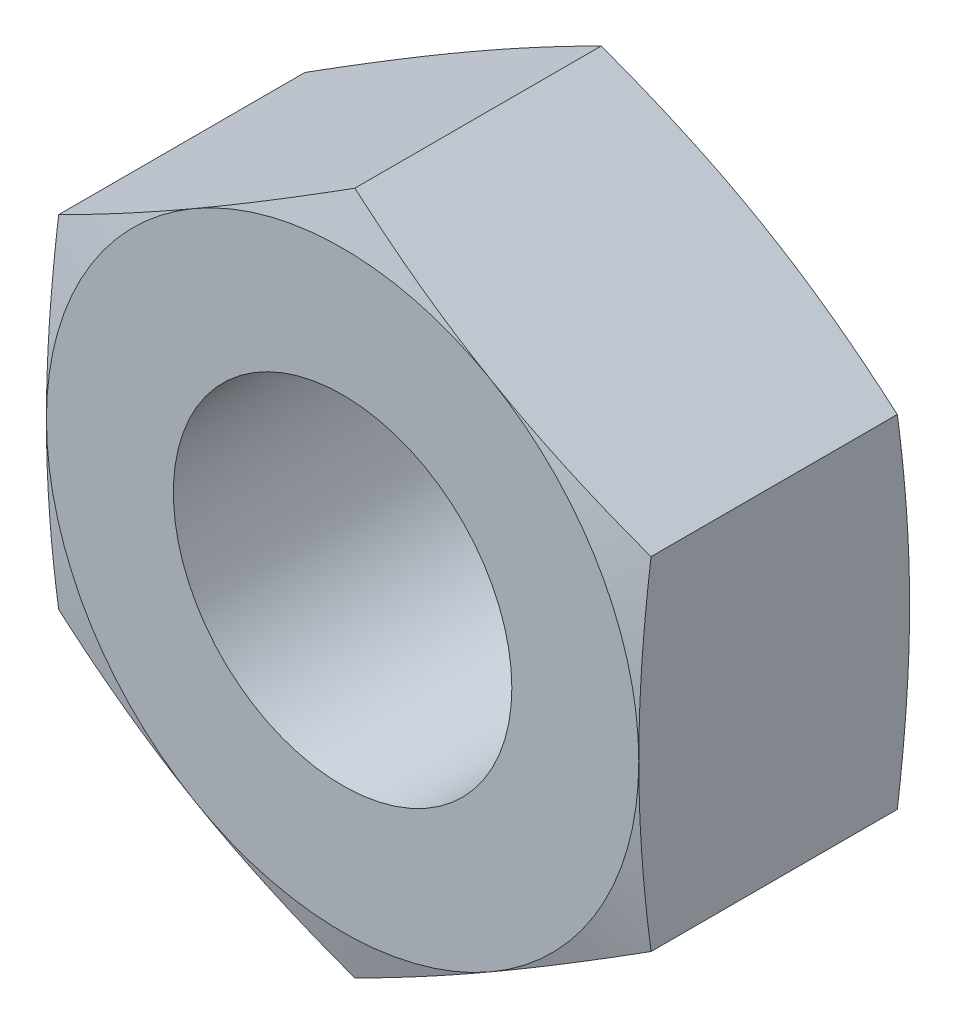
ISO-10303-21;
HEADER;
FILE_DESCRIPTION(('STEP AP214'),'2;1');
FILE_NAME('part.step','',(''),(''),'','','');
FILE_SCHEMA(('AUTOMOTIVE_DESIGN { 1 0 10303 214 1 1 1 1 }'));
ENDSEC;
DATA;
#1=APPLICATION_CONTEXT('core data for automotive mechanical design processes');
#2=APPLICATION_PROTOCOL_DEFINITION('international standard','automotive_design',2000,#1);
#3=PRODUCT_CONTEXT('',#1,'mechanical');
#4=PRODUCT('Part','Part','',(#3));
#5=PRODUCT_RELATED_PRODUCT_CATEGORY('part','',(#4));
#6=PRODUCT_DEFINITION_FORMATION('','',#4);
#7=PRODUCT_DEFINITION_CONTEXT('part definition',#1,'design');
#8=PRODUCT_DEFINITION('design','',#6,#7);
#9=PRODUCT_DEFINITION_SHAPE('','',#8);
#10=(LENGTH_UNIT() NAMED_UNIT(*) SI_UNIT(.MILLI.,.METRE.));
#11=(NAMED_UNIT(*) PLANE_ANGLE_UNIT() SI_UNIT($,.RADIAN.));
#12=(NAMED_UNIT(*) SI_UNIT($,.STERADIAN.) SOLID_ANGLE_UNIT());
#13=UNCERTAINTY_MEASURE_WITH_UNIT(LENGTH_MEASURE(1.E-05),#10,'distance_accuracy_value','');
#14=(GEOMETRIC_REPRESENTATION_CONTEXT(3) GLOBAL_UNCERTAINTY_ASSIGNED_CONTEXT((#13)) GLOBAL_UNIT_ASSIGNED_CONTEXT((#10,
#11,#12)) REPRESENTATION_CONTEXT('',''));
#15=CARTESIAN_POINT('',(0.,0.,0.));
#16=DIRECTION('',(0.,0.,1.));
#17=DIRECTION('',(1.,0.,0.));
#18=AXIS2_PLACEMENT_3D('',#15,#16,#17);
#19=CARTESIAN_POINT('',(3.49999999999998,2.02072594216372,3.2));
#20=DIRECTION('',(-0.499999999999994,-0.866025403784442,0.));
#21=DIRECTION('',(0.866025403784442,-0.499999999999994,0.));
#22=AXIS2_PLACEMENT_3D('',#19,#20,#21);
#23=PLANE('',#22);
#24=CARTESIAN_POINT('',(-0.000200000000028189,4.04156735438122,0.145112536579482));
#25=CARTESIAN_POINT('',(0.145162765094319,3.95764212282385,0.122614406177996));
#26=CARTESIAN_POINT('',(0.290789105593145,3.87356471593575,0.102189745494033));
#27=CARTESIAN_POINT('',(0.582556123983412,3.70511294932748,0.0663054466052747));
#28=CARTESIAN_POINT('',(0.728696986526611,3.62073848299856,0.0508478254944845));
#29=CARTESIAN_POINT('',(1.02060691245242,3.45220420868618,0.0258000877464256));
#30=CARTESIAN_POINT('',(1.16637400154895,3.36804554055731,0.0161800979095289));
#31=CARTESIAN_POINT('',(1.45809408806272,3.19962087008056,0.00328066753314813));
#32=CARTESIAN_POINT('',(1.60404704403135,3.11535489166306,0.));
#33=CARTESIAN_POINT('',(1.89595295596861,2.94682293482804,0.));
#34=CARTESIAN_POINT('',(2.04190591193724,2.86255695641053,0.00328066753314751));
#35=CARTESIAN_POINT('',(2.333625998451,2.69413228593379,0.0161800979095276));
#36=CARTESIAN_POINT('',(2.47939308754754,2.60997361780492,0.0258000877464239));
#37=CARTESIAN_POINT('',(2.77130301347335,2.44143934349253,0.0508478254944822));
#38=CARTESIAN_POINT('',(2.91744387601654,2.35706487716361,0.0663054466052721));
#39=CARTESIAN_POINT('',(3.20921089440681,2.18861311055534,0.102189745494029));
#40=CARTESIAN_POINT('',(3.35483723490564,2.10453570366725,0.122614406177993));
#41=CARTESIAN_POINT('',(3.50019999999998,2.02061047210988,0.145112536579478));
#42=B_SPLINE_CURVE_WITH_KNOTS('',3,(#24,#25,#26,#27,#28,#29,#30,#31,#32,#33,#34,#35,#36,#37,#38,
#39,#40,#41),.UNSPECIFIED.,.F.,.F.,(4,2,2,2,2,2,2,2,4),(0.,0.508081243376833,1.01636855642799,
1.52203235492776,2.02759827097034,2.53316418701292,3.03882798551268,3.54711529856384,
4.05519654194067),.UNSPECIFIED.);
#43=CARTESIAN_POINT('',(0.,4.04145188432738,0.14508159514584));
#44=VERTEX_POINT('',#43);
#45=CARTESIAN_POINT('',(1.75,3.03108891324553,0.));
#46=VERTEX_POINT('',#45);
#47=EDGE_CURVE('E48',#44,#46,#42,.T.);
#48=ORIENTED_EDGE('',*,*,#47,.F.);
#49=DIRECTION('',(0.,0.,-1.));
#50=VECTOR('',#49,1.);
#51=CARTESIAN_POINT('',(0.,4.04145188432738,3.2));
#52=LINE('',#51,#50);
#53=CARTESIAN_POINT('',(0.,4.04145188432738,3.05491840485416));
#54=VERTEX_POINT('',#53);
#55=EDGE_CURVE('E163',#54,#44,#52,.T.);
#56=ORIENTED_EDGE('',*,*,#55,.F.);
#57=CARTESIAN_POINT('',(3.50019999999998,2.02061047210988,3.05488746342052));
#58=CARTESIAN_POINT('',(3.35483723490564,2.10453570366725,3.07738559382201));
#59=CARTESIAN_POINT('',(3.20921089440681,2.18861311055534,3.09781025450597));
#60=CARTESIAN_POINT('',(2.91744387601655,2.35706487716361,3.13369455339473));
#61=CARTESIAN_POINT('',(2.77130301347335,2.44143934349253,3.14915217450552));
#62=CARTESIAN_POINT('',(2.47939308754754,2.60997361780492,3.17419991225358));
#63=CARTESIAN_POINT('',(2.333625998451,2.69413228593379,3.18381990209047));
#64=CARTESIAN_POINT('',(2.04190591193724,2.86255695641053,3.19671933246685));
#65=CARTESIAN_POINT('',(1.89595295596861,2.94682293482804,3.19999999999999));
#66=CARTESIAN_POINT('',(1.60404704403135,3.11535489166306,3.19999999999999));
#67=CARTESIAN_POINT('',(1.45809408806272,3.19962087008056,3.19671933246685));
#68=CARTESIAN_POINT('',(1.16637400154895,3.36804554055731,3.18381990209047));
#69=CARTESIAN_POINT('',(1.02060691245242,3.45220420868618,3.17419991225357));
#70=CARTESIAN_POINT('',(0.728696986526611,3.62073848299856,3.14915217450552));
#71=CARTESIAN_POINT('',(0.582556123983412,3.70511294932748,3.13369455339473));
#72=CARTESIAN_POINT('',(0.290789105593145,3.87356471593575,3.09781025450597));
#73=CARTESIAN_POINT('',(0.145162765094319,3.95764212282385,3.077385593822));
#74=CARTESIAN_POINT('',(-0.000200000000028041,4.04156735438122,3.05488746342052));
#75=B_SPLINE_CURVE_WITH_KNOTS('',3,(#57,#58,#59,#60,#61,#62,#63,#64,#65,#66,#67,#68,#69,#70,#71,
#72,#73,#74),.UNSPECIFIED.,.F.,.F.,(4,2,2,2,2,2,2,2,4),(0.,0.508081243376833,1.01636855642799,
1.52203235492776,2.02759827097034,2.53316418701292,3.03882798551268,3.54711529856384,
4.05519654194067),.UNSPECIFIED.);
#76=CARTESIAN_POINT('',(1.74999999999999,3.03108891324554,3.19999999999999));
#77=VERTEX_POINT('',#76);
#78=EDGE_CURVE('E222',#77,#54,#75,.T.);
#79=ORIENTED_EDGE('',*,*,#78,.F.);
#80=CARTESIAN_POINT('',(3.49999999999998,2.02072594216384,3.05491840485441));
#81=VERTEX_POINT('',#80);
#82=EDGE_CURVE('E293',#81,#77,#75,.T.);
#83=ORIENTED_EDGE('',*,*,#82,.F.);
#84=DIRECTION('',(0.,0.,-1.));
#85=VECTOR('',#84,1.);
#86=CARTESIAN_POINT('',(3.49999999999998,2.02072594216372,3.2));
#87=LINE('',#86,#85);
#88=CARTESIAN_POINT('',(3.49999999999998,2.02072594216372,0.145081595145835));
#89=VERTEX_POINT('',#88);
#90=EDGE_CURVE('E149',#81,#89,#87,.T.);
#91=ORIENTED_EDGE('',*,*,#90,.T.);
#92=EDGE_CURVE('E142',#46,#89,#42,.T.);
#93=ORIENTED_EDGE('',*,*,#92,.F.);
#94=EDGE_LOOP('',(#48,#56,#79,#83,#91,#93));
#95=FACE_BOUND('',#94,.T.);
#96=ADVANCED_FACE('F32',(#95),#23,.F.);
#97=CARTESIAN_POINT('',(0.,4.04145188432738,3.2));
#98=DIRECTION('',(0.500000000000006,-0.866025403784435,0.));
#99=DIRECTION('',(0.866025403784435,0.500000000000006,0.));
#100=AXIS2_PLACEMENT_3D('',#97,#98,#99);
#101=PLANE('',#100);
#102=CARTESIAN_POINT('',(-3.50020000000001,2.02061047210983,0.145112536579478));
#103=CARTESIAN_POINT('',(-3.35483723490567,2.1045357036672,0.122614406177993));
#104=CARTESIAN_POINT('',(-3.20921089440684,2.1886131105553,0.102189745494029));
#105=CARTESIAN_POINT('',(-2.91744387601658,2.35706487716357,0.0663054466052721));
#106=CARTESIAN_POINT('',(-2.77130301347338,2.44143934349249,0.0508478254944823));
#107=CARTESIAN_POINT('',(-2.47939308754757,2.60997361780488,0.025800087746424));
#108=CARTESIAN_POINT('',(-2.33362599845104,2.69413228593376,0.0161800979095277));
#109=CARTESIAN_POINT('',(-2.04190591193728,2.8625569564105,0.00328066753314761));
#110=CARTESIAN_POINT('',(-1.89595295596865,2.94682293482801,0.));
#111=CARTESIAN_POINT('',(-1.60404704403139,3.11535489166303,0.));
#112=CARTESIAN_POINT('',(-1.45809408806276,3.19962087008054,0.00328066753314814));
#113=CARTESIAN_POINT('',(-1.166374001549,3.36804554055729,0.0161800979095289));
#114=CARTESIAN_POINT('',(-1.02060691245247,3.45220420868616,0.0258000877464256));
#115=CARTESIAN_POINT('',(-0.728696986526662,3.62073848299855,0.0508478254944846));
#116=CARTESIAN_POINT('',(-0.582556123983463,3.70511294932747,0.0663054466052748));
#117=CARTESIAN_POINT('',(-0.290789105593199,3.87356471593575,0.102189745494033));
#118=CARTESIAN_POINT('',(-0.145162765094374,3.95764212282385,0.122614406177997));
#119=CARTESIAN_POINT('',(0.000199999999971753,4.04156735438122,0.145112536579482));
#120=B_SPLINE_CURVE_WITH_KNOTS('',3,(#102,#103,#104,#105,#106,#107,#108,#109,#110,#111,#112,
#113,#114,#115,#116,#117,#118,#119),.UNSPECIFIED.,.F.,.F.,(4,2,2,2,2,2,2,2,4),(0.,
0.508081243376833,1.01636855642799,1.52203235492776,2.02759827097034,2.53316418701292,
3.03882798551268,3.54711529856384,4.05519654194067),.UNSPECIFIED.);
#121=CARTESIAN_POINT('',(-3.50000000000001,2.02072594216379,0.145081595145587));
#122=VERTEX_POINT('',#121);
#123=CARTESIAN_POINT('',(-1.74999999999998,3.03108891324555,0.));
#124=VERTEX_POINT('',#123);
#125=EDGE_CURVE('E55',#122,#124,#120,.T.);
#126=ORIENTED_EDGE('',*,*,#125,.F.);
#127=DIRECTION('',(0.,0.,-1.));
#128=VECTOR('',#127,1.);
#129=CARTESIAN_POINT('',(-3.50000000000001,2.02072594216367,3.2));
#130=LINE('',#129,#128);
#131=CARTESIAN_POINT('',(-3.50000000000001,2.02072594216367,3.05491840485416));
#132=VERTEX_POINT('',#131);
#133=EDGE_CURVE('E160',#132,#122,#130,.T.);
#134=ORIENTED_EDGE('',*,*,#133,.F.);
#135=CARTESIAN_POINT('',(0.000199999999971874,4.04156735438122,3.05488746342052));
#136=CARTESIAN_POINT('',(-0.145162765094374,3.95764212282385,3.077385593822));
#137=CARTESIAN_POINT('',(-0.2907891055932,3.87356471593575,3.09781025450597));
#138=CARTESIAN_POINT('',(-0.582556123983463,3.70511294932747,3.13369455339473));
#139=CARTESIAN_POINT('',(-0.728696986526662,3.62073848299855,3.14915217450552));
#140=CARTESIAN_POINT('',(-1.02060691245247,3.45220420868616,3.17419991225357));
#141=CARTESIAN_POINT('',(-1.166374001549,3.36804554055729,3.18381990209047));
#142=CARTESIAN_POINT('',(-1.45809408806277,3.19962087008054,3.19671933246685));
#143=CARTESIAN_POINT('',(-1.60404704403139,3.11535489166303,3.19999999999999));
#144=CARTESIAN_POINT('',(-1.89595295596865,2.94682293482801,3.19999999999999));
#145=CARTESIAN_POINT('',(-2.04190591193728,2.8625569564105,3.19671933246685));
#146=CARTESIAN_POINT('',(-2.33362599845104,2.69413228593376,3.18381990209047));
#147=CARTESIAN_POINT('',(-2.47939308754757,2.60997361780488,3.17419991225358));
#148=CARTESIAN_POINT('',(-2.77130301347338,2.44143934349249,3.14915217450552));
#149=CARTESIAN_POINT('',(-2.91744387601658,2.35706487716357,3.13369455339473));
#150=CARTESIAN_POINT('',(-3.20921089440684,2.1886131105553,3.09781025450597));
#151=CARTESIAN_POINT('',(-3.35483723490567,2.1045357036672,3.07738559382201));
#152=CARTESIAN_POINT('',(-3.50020000000002,2.02061047210983,3.05488746342052));
#153=B_SPLINE_CURVE_WITH_KNOTS('',3,(#135,#136,#137,#138,#139,#140,#141,#142,#143,#144,#145,
#146,#147,#148,#149,#150,#151,#152),.UNSPECIFIED.,.F.,.F.,(4,2,2,2,2,2,2,2,4),(0.,
0.508081243376833,1.01636855642799,1.52203235492776,2.02759827097034,2.53316418701292,
3.03882798551268,3.54711529856384,4.05519654194067),.UNSPECIFIED.);
#154=CARTESIAN_POINT('',(-1.75000000000003,3.03108891324552,3.19999999999999));
#155=VERTEX_POINT('',#154);
#156=EDGE_CURVE('E215',#155,#132,#153,.T.);
#157=ORIENTED_EDGE('',*,*,#156,.F.);
#158=EDGE_CURVE('E220',#54,#155,#153,.T.);
#159=ORIENTED_EDGE('',*,*,#158,.F.);
#160=ORIENTED_EDGE('',*,*,#55,.T.);
#161=EDGE_CURVE('E240',#124,#44,#120,.T.);
#162=ORIENTED_EDGE('',*,*,#161,.F.);
#163=EDGE_LOOP('',(#126,#134,#157,#159,#160,#162));
#164=FACE_BOUND('',#163,.T.);
#165=ADVANCED_FACE('F228',(#164),#101,.F.);
#166=CARTESIAN_POINT('',(-3.50000000000001,2.02072594216367,3.2));
#167=DIRECTION('',(1.,0.,0.));
#168=DIRECTION('',(0.,1.,0.));
#169=AXIS2_PLACEMENT_3D('',#166,#167,#168);
#170=PLANE('',#169);
#171=CARTESIAN_POINT('',(-3.49999999999996,-6.08231438273591,0.942496812972615));
#172=CARTESIAN_POINT('',(-3.49999999999996,-5.93496997142404,0.908280034486262));
#173=CARTESIAN_POINT('',(-3.49999999999996,-5.78755875061416,0.874350671842124));
#174=CARTESIAN_POINT('',(-3.49999999999996,-5.49257494592613,0.807189875916528));
#175=CARTESIAN_POINT('',(-3.49999999999996,-5.34500235942206,0.773958454176147));
#176=CARTESIAN_POINT('',(-3.49999999999996,-4.90195015993198,0.675484528750551));
#177=CARTESIAN_POINT('',(-3.49999999999997,-4.60619404244802,0.611475920789179));
#178=CARTESIAN_POINT('',(-3.49999999999997,-4.01091746107506,0.487654110094287));
#179=CARTESIAN_POINT('',(-3.49999999999997,-3.71138760386842,0.427885569417705));
#180=CARTESIAN_POINT('',(-3.49999999999998,-3.11092895451621,0.315582680448664));
#181=CARTESIAN_POINT('',(-3.49999999999998,-2.81000004419115,0.263048955203392));
#182=CARTESIAN_POINT('',(-3.49999999999998,-2.2145169469613,0.170116506253298));
#183=CARTESIAN_POINT('',(-3.49999999999999,-1.92000974576957,0.129428692769404));
#184=CARTESIAN_POINT('',(-3.49999999999999,-1.4770265260869,0.0794580132589875));
#185=CARTESIAN_POINT('',(-3.49999999999999,-1.32917504670329,0.0646454604688738));
#186=CARTESIAN_POINT('',(-3.49999999999999,-1.03311110769941,0.039279871528778));
#187=CARTESIAN_POINT('',(-3.49999999999999,-0.884898673681529,0.0287265416450267));
#188=CARTESIAN_POINT('',(-3.5,-0.588850023319857,0.0123919060059179));
#189=CARTESIAN_POINT('',(-3.5,-0.441014950932604,0.00659016541461428));
#190=CARTESIAN_POINT('',(-3.5,-0.145231939726513,-2.37858600562096E-05));
#191=CARTESIAN_POINT('',(-3.5,0.00271599858114014,-0.000836019008922484));
#192=CARTESIAN_POINT('',(-3.5,0.298564320244249,0.00257247967451371));
#193=CARTESIAN_POINT('',(-3.5,0.446464699176093,0.00679359077087732));
#194=CARTESIAN_POINT('',(-3.50000000000001,0.742044587399082,0.0200495270965617));
#195=CARTESIAN_POINT('',(-3.50000000000001,0.889724096907494,0.0290843475875837));
#196=CARTESIAN_POINT('',(-3.50000000000001,1.24799769651746,0.0563626750480757));
#197=CARTESIAN_POINT('',(-3.50000000000001,1.45841760569053,0.0768935982407064));
#198=CARTESIAN_POINT('',(-3.50000000000001,1.87837650424081,0.125307320037199));
#199=CARTESIAN_POINT('',(-3.50000000000001,2.08791552754702,0.153189832795219));
#200=CARTESIAN_POINT('',(-3.50000000000002,2.50679467023218,0.214772129432317));
#201=CARTESIAN_POINT('',(-3.50000000000002,2.71613211326999,0.248489851714942));
#202=CARTESIAN_POINT('',(-3.50000000000002,3.13405654790184,0.320301349714132));
#203=CARTESIAN_POINT('',(-3.50000000000002,3.34264350213558,0.358395340261629));
#204=CARTESIAN_POINT('',(-3.50000000000003,3.76345188083417,0.438699215653414));
#205=CARTESIAN_POINT('',(-3.50000000000003,3.97566015956539,0.480977464062045));
#206=CARTESIAN_POINT('',(-3.50000000000003,4.39954296626354,0.568127118180188));
#207=CARTESIAN_POINT('',(-3.50000000000003,4.61121748831011,0.61299855252216));
#208=CARTESIAN_POINT('',(-3.50000000000004,5.03299514228896,0.704462077179181));
#209=CARTESIAN_POINT('',(-3.50000000000004,5.24310058516725,0.751043560929254));
#210=CARTESIAN_POINT('',(-3.50000000000004,5.66295275734479,0.845730998625034));
#211=CARTESIAN_POINT('',(-3.50000000000004,5.87269951071569,0.893836845670348));
#212=CARTESIAN_POINT('',(-3.50000000000004,6.08231438273586,0.942496812972647));
#213=B_SPLINE_CURVE_WITH_KNOTS('',3,(#171,#172,#173,#174,#175,#176,#177,#178,#179,#180,#181,
#182,#183,#184,#185,#186,#187,#188,#189,#190,#191,#192,#193,#194,#195,#196,#197,#198,#199,#200,
#201,#202,#203,#204,#205,#206,#207,#208,#209,#210,#211,#212),.UNSPECIFIED.,.F.,.F.,(4,2,2,2,2,2,
2,2,2,2,2,2,2,2,2,2,2,2,2,2,4),(0.,0.453795147959019,0.907597793927532,1.8153815784239,
2.731626065965,3.64794940929116,4.53955746134001,4.9852814531466,5.43097470071364,
5.87474096882979,6.31850523886532,6.76230294879029,7.20610022187081,7.84018526166536,
8.47424565048497,9.11029104241077,9.74636767114639,10.3954830565977,11.0446056105751,
11.6902209684929,12.3357911505275),.UNSPECIFIED.);
#214=CARTESIAN_POINT('',(-3.49999999999999,-2.02072594216371,0.145081595145827));
#215=VERTEX_POINT('',#214);
#216=CARTESIAN_POINT('',(-3.5,0.,0.));
#217=VERTEX_POINT('',#216);
#218=EDGE_CURVE('E242',#215,#217,#213,.T.);
#219=ORIENTED_EDGE('',*,*,#218,.F.);
#220=DIRECTION('',(0.,0.,-1.));
#221=VECTOR('',#220,1.);
#222=CARTESIAN_POINT('',(-3.49999999999999,-2.02072594216371,3.2));
#223=LINE('',#222,#221);
#224=CARTESIAN_POINT('',(-3.49999999999999,-2.02072594216371,3.05491840485417));
#225=VERTEX_POINT('',#224);
#226=EDGE_CURVE('E151',#225,#215,#223,.T.);
#227=ORIENTED_EDGE('',*,*,#226,.F.);
#228=CARTESIAN_POINT('',(-3.50000000000004,6.08231438273586,2.25750318702735));
#229=CARTESIAN_POINT('',(-3.50000000000004,5.934969971424,2.29171996551371));
#230=CARTESIAN_POINT('',(-3.50000000000004,5.78755875061411,2.32564932815785));
#231=CARTESIAN_POINT('',(-3.50000000000004,5.49257494592609,2.39281012408344));
#232=CARTESIAN_POINT('',(-3.50000000000004,5.34500235942201,2.42604154582382));
#233=CARTESIAN_POINT('',(-3.50000000000003,4.90195015993194,2.52451547124942));
#234=CARTESIAN_POINT('',(-3.50000000000003,4.60619404244798,2.5885240792108));
#235=CARTESIAN_POINT('',(-3.50000000000003,4.01091746107502,2.71234588990569));
#236=CARTESIAN_POINT('',(-3.50000000000003,3.71138760386838,2.77211443058228));
#237=CARTESIAN_POINT('',(-3.50000000000002,3.11092895451618,2.88441731955132));
#238=CARTESIAN_POINT('',(-3.50000000000002,2.81000004419112,2.93695104479659));
#239=CARTESIAN_POINT('',(-3.50000000000002,2.21451694696127,3.02988349374669));
#240=CARTESIAN_POINT('',(-3.50000000000001,1.92000974576954,3.07057130723059));
#241=CARTESIAN_POINT('',(-3.50000000000001,1.47702652608687,3.120541986741));
#242=CARTESIAN_POINT('',(-3.50000000000001,1.32917504670326,3.13535453953112));
#243=CARTESIAN_POINT('',(-3.50000000000001,1.03311110769938,3.16072012847122));
#244=CARTESIAN_POINT('',(-3.50000000000001,0.884898673681506,3.17127345835497));
#245=CARTESIAN_POINT('',(-3.5,0.588850023319836,3.18760809399408));
#246=CARTESIAN_POINT('',(-3.5,0.441014950932583,3.19340983458538));
#247=CARTESIAN_POINT('',(-3.5,0.145231939726494,3.20002378586006));
#248=CARTESIAN_POINT('',(-3.5,-0.00271599858115855,3.20083601900892));
#249=CARTESIAN_POINT('',(-3.5,-0.298564320244267,3.19742752032549));
#250=CARTESIAN_POINT('',(-3.5,-0.44646469917611,3.19320640922913));
#251=CARTESIAN_POINT('',(-3.49999999999999,-0.742044587399098,3.17995047290344));
#252=CARTESIAN_POINT('',(-3.49999999999999,-0.889724096907509,3.17091565241242));
#253=CARTESIAN_POINT('',(-3.49999999999999,-1.24799769651747,3.14363732495193));
#254=CARTESIAN_POINT('',(-3.49999999999999,-1.45841760569054,3.1231064017593));
#255=CARTESIAN_POINT('',(-3.49999999999999,-1.87837650424082,3.07469267996281));
#256=CARTESIAN_POINT('',(-3.49999999999998,-2.08791552754704,3.04681016720479));
#257=CARTESIAN_POINT('',(-3.49999999999998,-2.5067946702322,2.9852278705677));
#258=CARTESIAN_POINT('',(-3.49999999999998,-2.71613211327002,2.95151014828507));
#259=CARTESIAN_POINT('',(-3.49999999999998,-3.13405654790187,2.87969865028589));
#260=CARTESIAN_POINT('',(-3.49999999999998,-3.34264350213562,2.84160465973839));
#261=CARTESIAN_POINT('',(-3.49999999999997,-3.76345188083421,2.76130078434661));
#262=CARTESIAN_POINT('',(-3.49999999999997,-3.97566015956542,2.71902253593798));
#263=CARTESIAN_POINT('',(-3.49999999999997,-4.39954296626358,2.63187288181984));
#264=CARTESIAN_POINT('',(-3.49999999999997,-4.61121748831015,2.58700144747786));
#265=CARTESIAN_POINT('',(-3.49999999999996,-5.032995142289,2.49553792282084));
#266=CARTESIAN_POINT('',(-3.49999999999996,-5.2431005851673,2.44895643907077));
#267=CARTESIAN_POINT('',(-3.49999999999996,-5.66295275734483,2.354269001375));
#268=CARTESIAN_POINT('',(-3.49999999999996,-5.87269951071574,2.30616315432968));
#269=CARTESIAN_POINT('',(-3.49999999999996,-6.08231438273591,2.25750318702738));
#270=B_SPLINE_CURVE_WITH_KNOTS('',3,(#228,#229,#230,#231,#232,#233,#234,#235,#236,#237,#238,
#239,#240,#241,#242,#243,#244,#245,#246,#247,#248,#249,#250,#251,#252,#253,#254,#255,#256,#257,
#258,#259,#260,#261,#262,#263,#264,#265,#266,#267,#268,#269),.UNSPECIFIED.,.F.,.F.,(4,2,2,2,2,2,
2,2,2,2,2,2,2,2,2,2,2,2,2,2,4),(0.,0.453795147959018,0.907597793927529,1.81538157842389,
2.73162606596499,3.64794940929115,4.53955746133999,4.98528145314657,5.43097470071362,
5.87474096882977,6.3185052388653,6.76230294879027,7.20610022187078,7.84018526166533,
8.47424565048495,9.11029104241075,9.74636767114637,10.3954830565976,11.0446056105751,
11.6902209684929,12.3357911505275),.UNSPECIFIED.);
#271=CARTESIAN_POINT('',(-3.5,0.,3.2));
#272=VERTEX_POINT('',#271);
#273=EDGE_CURVE('E208',#272,#225,#270,.T.);
#274=ORIENTED_EDGE('',*,*,#273,.F.);
#275=EDGE_CURVE('E221',#132,#272,#270,.T.);
#276=ORIENTED_EDGE('',*,*,#275,.F.);
#277=ORIENTED_EDGE('',*,*,#133,.T.);
#278=EDGE_CURVE('E241',#217,#122,#213,.T.);
#279=ORIENTED_EDGE('',*,*,#278,.F.);
#280=EDGE_LOOP('',(#219,#227,#274,#276,#277,#279));
#281=FACE_BOUND('',#280,.T.);
#282=ADVANCED_FACE('F231',(#281),#170,.F.);
#283=CARTESIAN_POINT('',(-3.49999999999999,-2.02072594216371,3.2));
#284=DIRECTION('',(0.499999999999993,0.866025403784443,0.));
#285=DIRECTION('',(-0.866025403784443,0.499999999999993,0.));
#286=AXIS2_PLACEMENT_3D('',#283,#284,#285);
#287=PLANE('',#286);
#288=CARTESIAN_POINT('',(0.000200000000028221,-4.04156735438121,0.145112536579465));
#289=CARTESIAN_POINT('',(-0.145162765094319,-3.95764212282384,0.12261440617798));
#290=CARTESIAN_POINT('',(-0.290789105593146,-3.87356471593575,0.102189745494016));
#291=CARTESIAN_POINT('',(-0.582556123983412,-3.70511294932748,0.0663054466052595));
#292=CARTESIAN_POINT('',(-0.728696986526611,-3.62073848299856,0.05084782549447));
#293=CARTESIAN_POINT('',(-1.02060691245242,-3.45220420868617,0.025800087746412));
#294=CARTESIAN_POINT('',(-1.16637400154895,-3.3680455405573,0.0161800979095158));
#295=CARTESIAN_POINT('',(-1.45809408806272,-3.19962087008056,0.00328066753313595));
#296=CARTESIAN_POINT('',(-1.60404704403135,-3.11535489166305,0.));
#297=CARTESIAN_POINT('',(-1.89595295596861,-2.94682293482804,0.));
#298=CARTESIAN_POINT('',(-2.04190591193724,-2.86255695641053,0.00328066753313694));
#299=CARTESIAN_POINT('',(-2.333625998451,-2.69413228593379,0.0161800979095176));
#300=CARTESIAN_POINT('',(-2.47939308754754,-2.60997361780492,0.0258000877464142));
#301=CARTESIAN_POINT('',(-2.77130301347335,-2.44143934349253,0.050847825494473));
#302=CARTESIAN_POINT('',(-2.91744387601655,-2.35706487716361,0.066305446605263));
#303=CARTESIAN_POINT('',(-3.20921089440681,-2.18861311055534,0.102189745494021));
#304=CARTESIAN_POINT('',(-3.35483723490564,-2.10453570366724,0.122614406177985));
#305=CARTESIAN_POINT('',(-3.50019999999999,-2.02061047210988,0.14511253657947));
#306=B_SPLINE_CURVE_WITH_KNOTS('',3,(#288,#289,#290,#291,#292,#293,#294,#295,#296,#297,#298,
#299,#300,#301,#302,#303,#304,#305),.UNSPECIFIED.,.F.,.F.,(4,2,2,2,2,2,2,2,4),(0.,
0.508081243376833,1.01636855642799,1.52203235492776,2.02759827097033,2.53316418701291,
3.03882798551268,3.54711529856384,4.05519654194067),.UNSPECIFIED.);
#307=CARTESIAN_POINT('',(0.,-4.04145188432738,0.145081595145822));
#308=VERTEX_POINT('',#307);
#309=CARTESIAN_POINT('',(-1.74999999999995,-3.03108891324556,0.));
#310=VERTEX_POINT('',#309);
#311=EDGE_CURVE('E249',#308,#310,#306,.T.);
#312=ORIENTED_EDGE('',*,*,#311,.F.);
#313=DIRECTION('',(0.,0.,-1.));
#314=VECTOR('',#313,1.);
#315=CARTESIAN_POINT('',(0.,-4.04145188432738,3.2));
#316=LINE('',#315,#314);
#317=CARTESIAN_POINT('',(0.,-4.04145188432738,3.05491840485418));
#318=VERTEX_POINT('',#317);
#319=EDGE_CURVE('E148',#318,#308,#316,.T.);
#320=ORIENTED_EDGE('',*,*,#319,.F.);
#321=CARTESIAN_POINT('',(-3.50019999999999,-2.02061047210988,3.05488746342053));
#322=CARTESIAN_POINT('',(-3.35483723490564,-2.10453570366724,3.07738559382202));
#323=CARTESIAN_POINT('',(-3.20921089440681,-2.18861311055534,3.09781025450598));
#324=CARTESIAN_POINT('',(-2.91744387601655,-2.35706487716361,3.13369455339474));
#325=CARTESIAN_POINT('',(-2.77130301347335,-2.44143934349253,3.14915217450553));
#326=CARTESIAN_POINT('',(-2.47939308754754,-2.60997361780492,3.17419991225359));
#327=CARTESIAN_POINT('',(-2.333625998451,-2.69413228593379,3.18381990209048));
#328=CARTESIAN_POINT('',(-2.04190591193724,-2.86255695641053,3.19671933246686));
#329=CARTESIAN_POINT('',(-1.89595295596861,-2.94682293482804,3.2));
#330=CARTESIAN_POINT('',(-1.60404704403135,-3.11535489166305,3.2));
#331=CARTESIAN_POINT('',(-1.45809408806272,-3.19962087008056,3.19671933246686));
#332=CARTESIAN_POINT('',(-1.16637400154895,-3.3680455405573,3.18381990209048));
#333=CARTESIAN_POINT('',(-1.02060691245242,-3.45220420868617,3.17419991225359));
#334=CARTESIAN_POINT('',(-0.728696986526611,-3.62073848299856,3.14915217450553));
#335=CARTESIAN_POINT('',(-0.582556123983412,-3.70511294932748,3.13369455339474));
#336=CARTESIAN_POINT('',(-0.290789105593145,-3.87356471593575,3.09781025450598));
#337=CARTESIAN_POINT('',(-0.145162765094318,-3.95764212282384,3.07738559382202));
#338=CARTESIAN_POINT('',(0.000200000000029008,-4.04156735438121,3.05488746342054));
#339=B_SPLINE_CURVE_WITH_KNOTS('',3,(#321,#322,#323,#324,#325,#326,#327,#328,#329,#330,#331,
#332,#333,#334,#335,#336,#337,#338),.UNSPECIFIED.,.F.,.F.,(4,2,2,2,2,2,2,2,4),(0.,
0.508081243376833,1.01636855642799,1.52203235492776,2.02759827097033,2.53316418701291,
3.03882798551268,3.54711529856384,4.05519654194067),.UNSPECIFIED.);
#340=CARTESIAN_POINT('',(-1.74999999999996,-3.03108891324555,3.2));
#341=VERTEX_POINT('',#340);
#342=EDGE_CURVE('E201',#341,#318,#339,.T.);
#343=ORIENTED_EDGE('',*,*,#342,.F.);
#344=EDGE_CURVE('E319',#225,#341,#339,.T.);
#345=ORIENTED_EDGE('',*,*,#344,.F.);
#346=ORIENTED_EDGE('',*,*,#226,.T.);
#347=EDGE_CURVE('E248',#310,#215,#306,.T.);
#348=ORIENTED_EDGE('',*,*,#347,.F.);
#349=EDGE_LOOP('',(#312,#320,#343,#345,#346,#348));
#350=FACE_BOUND('',#349,.T.);
#351=ADVANCED_FACE('F259',(#350),#287,.F.);
#352=CARTESIAN_POINT('',(0.,-4.04145188432738,3.2));
#353=DIRECTION('',(-0.500000000000005,0.866025403784436,0.));
#354=DIRECTION('',(-0.866025403784436,-0.500000000000005,0.));
#355=AXIS2_PLACEMENT_3D('',#352,#353,#354);
#356=PLANE('',#355);
#357=CARTESIAN_POINT('',(3.50020000000001,-2.02061047210983,0.14511253657947));
#358=CARTESIAN_POINT('',(3.35483723490567,-2.1045357036672,0.122614406177985));
#359=CARTESIAN_POINT('',(3.20921089440684,-2.1886131105553,0.102189745494021));
#360=CARTESIAN_POINT('',(2.91744387601658,-2.35706487716357,0.0663054466052633));
#361=CARTESIAN_POINT('',(2.77130301347338,-2.44143934349249,0.0508478254944733));
#362=CARTESIAN_POINT('',(2.47939308754757,-2.60997361780488,0.0258000877464144));
#363=CARTESIAN_POINT('',(2.33362599845104,-2.69413228593376,0.0161800979095177));
#364=CARTESIAN_POINT('',(2.04190591193728,-2.8625569564105,0.00328066753313697));
#365=CARTESIAN_POINT('',(1.89595295596865,-2.94682293482801,0.));
#366=CARTESIAN_POINT('',(1.60404704403139,-3.11535489166303,0.));
#367=CARTESIAN_POINT('',(1.45809408806276,-3.19962087008054,0.00328066753313616));
#368=CARTESIAN_POINT('',(1.166374001549,-3.36804554055729,0.016180097909516));
#369=CARTESIAN_POINT('',(1.02060691245247,-3.45220420868616,0.0258000877464121));
#370=CARTESIAN_POINT('',(0.728696986526662,-3.62073848299855,0.0508478254944699));
#371=CARTESIAN_POINT('',(0.582556123983464,-3.70511294932747,0.0663054466052595));
#372=CARTESIAN_POINT('',(0.2907891055932,-3.87356471593574,0.102189745494016));
#373=CARTESIAN_POINT('',(0.145162765094374,-3.95764212282384,0.12261440617798));
#374=CARTESIAN_POINT('',(-0.000199999999972162,-4.04156735438121,0.145112536579465));
#375=B_SPLINE_CURVE_WITH_KNOTS('',3,(#357,#358,#359,#360,#361,#362,#363,#364,#365,#366,#367,
#368,#369,#370,#371,#372,#373,#374),.UNSPECIFIED.,.F.,.F.,(4,2,2,2,2,2,2,2,4),(0.,
0.508081243376833,1.01636855642799,1.52203235492776,2.02759827097034,2.53316418701291,
3.03882798551268,3.54711529856384,4.05519654194067),.UNSPECIFIED.);
#376=CARTESIAN_POINT('',(3.50000000000001,-2.02072594216379,0.145081595145579));
#377=VERTEX_POINT('',#376);
#378=CARTESIAN_POINT('',(1.75000000000005,-3.0310889132455,0.));
#379=VERTEX_POINT('',#378);
#380=EDGE_CURVE('E126',#377,#379,#375,.T.);
#381=ORIENTED_EDGE('',*,*,#380,.F.);
#382=DIRECTION('',(0.,0.,-1.));
#383=VECTOR('',#382,1.);
#384=CARTESIAN_POINT('',(3.50000000000001,-2.02072594216367,3.2));
#385=LINE('',#384,#383);
#386=CARTESIAN_POINT('',(3.50000000000001,-2.02072594216367,3.05491840485417));
#387=VERTEX_POINT('',#386);
#388=EDGE_CURVE('E139',#387,#377,#385,.T.);
#389=ORIENTED_EDGE('',*,*,#388,.F.);
#390=CARTESIAN_POINT('',(-0.000199999999971816,-4.04156735438121,3.05488746342054));
#391=CARTESIAN_POINT('',(0.145162765094374,-3.95764212282384,3.07738559382202));
#392=CARTESIAN_POINT('',(0.2907891055932,-3.87356471593574,3.09781025450598));
#393=CARTESIAN_POINT('',(0.582556123983464,-3.70511294932747,3.13369455339474));
#394=CARTESIAN_POINT('',(0.728696986526662,-3.62073848299855,3.14915217450553));
#395=CARTESIAN_POINT('',(1.02060691245247,-3.45220420868616,3.17419991225359));
#396=CARTESIAN_POINT('',(1.166374001549,-3.36804554055729,3.18381990209048));
#397=CARTESIAN_POINT('',(1.45809408806277,-3.19962087008054,3.19671933246686));
#398=CARTESIAN_POINT('',(1.60404704403139,-3.11535489166303,3.2));
#399=CARTESIAN_POINT('',(1.89595295596865,-2.94682293482801,3.2));
#400=CARTESIAN_POINT('',(2.04190591193728,-2.8625569564105,3.19671933246686));
#401=CARTESIAN_POINT('',(2.33362599845104,-2.69413228593376,3.18381990209048));
#402=CARTESIAN_POINT('',(2.47939308754757,-2.60997361780488,3.17419991225359));
#403=CARTESIAN_POINT('',(2.77130301347338,-2.44143934349249,3.14915217450553));
#404=CARTESIAN_POINT('',(2.91744387601658,-2.35706487716357,3.13369455339474));
#405=CARTESIAN_POINT('',(3.20921089440684,-2.1886131105553,3.09781025450598));
#406=CARTESIAN_POINT('',(3.35483723490567,-2.1045357036672,3.07738559382202));
#407=CARTESIAN_POINT('',(3.50020000000001,-2.02061047210983,3.05488746342053));
#408=B_SPLINE_CURVE_WITH_KNOTS('',3,(#390,#391,#392,#393,#394,#395,#396,#397,#398,#399,#400,
#401,#402,#403,#404,#405,#406,#407),.UNSPECIFIED.,.F.,.F.,(4,2,2,2,2,2,2,2,4),(0.,
0.508081243376833,1.01636855642799,1.52203235492776,2.02759827097033,2.53316418701291,
3.03882798551268,3.54711529856384,4.05519654194067),.UNSPECIFIED.);
#409=CARTESIAN_POINT('',(1.75000000000001,-3.03108891324553,3.2));
#410=VERTEX_POINT('',#409);
#411=EDGE_CURVE('E193',#410,#387,#408,.T.);
#412=ORIENTED_EDGE('',*,*,#411,.F.);
#413=EDGE_CURVE('E327',#318,#410,#408,.T.);
#414=ORIENTED_EDGE('',*,*,#413,.F.);
#415=ORIENTED_EDGE('',*,*,#319,.T.);
#416=EDGE_CURVE('E141',#379,#308,#375,.T.);
#417=ORIENTED_EDGE('',*,*,#416,.F.);
#418=EDGE_LOOP('',(#381,#389,#412,#414,#415,#417));
#419=FACE_BOUND('',#418,.T.);
#420=ADVANCED_FACE('F137',(#419),#356,.F.);
#421=CARTESIAN_POINT('',(3.50000000000001,-2.02072594216367,3.2));
#422=DIRECTION('',(-1.,0.,0.));
#423=DIRECTION('',(0.,-1.,0.));
#424=AXIS2_PLACEMENT_3D('',#421,#422,#423);
#425=PLANE('',#424);
#426=CARTESIAN_POINT('',(3.49999999999996,6.08231438273591,0.942496812972648));
#427=CARTESIAN_POINT('',(3.49999999999996,5.93496997142405,0.908280034486294));
#428=CARTESIAN_POINT('',(3.49999999999996,5.78755875061416,0.874350671842154));
#429=CARTESIAN_POINT('',(3.49999999999996,5.49257494592614,0.807189875916557));
#430=CARTESIAN_POINT('',(3.49999999999996,5.34500235942206,0.773958454176176));
#431=CARTESIAN_POINT('',(3.49999999999996,4.90195015993199,0.675484528750577));
#432=CARTESIAN_POINT('',(3.49999999999997,4.60619404244803,0.611475920789204));
#433=CARTESIAN_POINT('',(3.49999999999997,4.01091746107507,0.487654110094309));
#434=CARTESIAN_POINT('',(3.49999999999997,3.71138760386843,0.427885569417725));
#435=CARTESIAN_POINT('',(3.49999999999998,3.11092895451623,0.315582680448681));
#436=CARTESIAN_POINT('',(3.49999999999998,2.81000004419117,0.263048955203406));
#437=CARTESIAN_POINT('',(3.49999999999998,2.21451694696132,0.17011650625331));
#438=CARTESIAN_POINT('',(3.49999999999999,1.92000974576959,0.129428692769415));
#439=CARTESIAN_POINT('',(3.49999999999999,1.47702652608692,0.0794580132589956));
#440=CARTESIAN_POINT('',(3.49999999999999,1.32917504670331,0.064645460468881));
#441=CARTESIAN_POINT('',(3.49999999999999,1.03311110769943,0.0392798715287836));
#442=CARTESIAN_POINT('',(3.49999999999999,0.884898673681555,0.0287265416450315));
#443=CARTESIAN_POINT('',(3.5,0.588850023319884,0.0123919060059212));
#444=CARTESIAN_POINT('',(3.5,0.441014950932632,0.00659016541461674));
#445=CARTESIAN_POINT('',(3.5,0.145231939726542,-2.37858600554019E-05));
#446=CARTESIAN_POINT('',(3.5,-0.00271599858111019,-0.000836019008922507));
#447=CARTESIAN_POINT('',(3.5,-0.298564320244218,0.00257247967451194));
#448=CARTESIAN_POINT('',(3.5,-0.446464699176061,0.00679359077087463));
#449=CARTESIAN_POINT('',(3.5,-0.742044587399049,0.0200495270965571));
#450=CARTESIAN_POINT('',(3.50000000000001,-0.889724096907461,0.0290843475875782));
#451=CARTESIAN_POINT('',(3.50000000000001,-1.24799769651742,0.0563626750480681));
#452=CARTESIAN_POINT('',(3.50000000000001,-1.4584176056905,0.0768935982406978));
#453=CARTESIAN_POINT('',(3.50000000000001,-1.87837650424078,0.125307320037188));
#454=CARTESIAN_POINT('',(3.50000000000001,-2.08791552754699,0.153189832795207));
#455=CARTESIAN_POINT('',(3.50000000000002,-2.50679467023215,0.214772129432303));
#456=CARTESIAN_POINT('',(3.50000000000002,-2.71613211326997,0.248489851714927));
#457=CARTESIAN_POINT('',(3.50000000000002,-3.13405654790183,0.320301349714116));
#458=CARTESIAN_POINT('',(3.50000000000002,-3.34264350213557,0.358395340261611));
#459=CARTESIAN_POINT('',(3.50000000000003,-3.76345188083416,0.438699215653394));
#460=CARTESIAN_POINT('',(3.50000000000003,-3.97566015956538,0.480977464062024));
#461=CARTESIAN_POINT('',(3.50000000000003,-4.39954296626353,0.568127118180166));
#462=CARTESIAN_POINT('',(3.50000000000003,-4.6112174883101,0.612998552522136));
#463=CARTESIAN_POINT('',(3.50000000000004,-5.03299514228896,0.704462077179156));
#464=CARTESIAN_POINT('',(3.50000000000004,-5.24310058516725,0.751043560929227));
#465=CARTESIAN_POINT('',(3.50000000000004,-5.66295275734479,0.845730998625006));
#466=CARTESIAN_POINT('',(3.50000000000004,-5.87269951071569,0.893836845670318));
#467=CARTESIAN_POINT('',(3.50000000000004,-6.08231438273586,0.942496812972616));
#468=B_SPLINE_CURVE_WITH_KNOTS('',3,(#426,#427,#428,#429,#430,#431,#432,#433,#434,#435,#436,
#437,#438,#439,#440,#441,#442,#443,#444,#445,#446,#447,#448,#449,#450,#451,#452,#453,#454,#455,
#456,#457,#458,#459,#460,#461,#462,#463,#464,#465,#466,#467),.UNSPECIFIED.,.F.,.F.,(4,2,2,2,2,2,
2,2,2,2,2,2,2,2,2,2,2,2,2,2,4),(0.,0.453795147959018,0.907597793927528,1.81538157842389,
2.73162606596499,3.64794940929115,4.53955746133999,4.98528145314658,5.43097470071362,
5.87474096882977,6.3185052388653,6.76230294879027,7.20610022187079,7.84018526166533,
8.47424565048495,9.11029104241076,9.74636767114638,10.3954830565977,11.0446056105751,
11.6902209684929,12.3357911505275),.UNSPECIFIED.);
#469=CARTESIAN_POINT('',(3.5,0.,0.));
#470=VERTEX_POINT('',#469);
#471=EDGE_CURVE('E133',#89,#470,#468,.T.);
#472=ORIENTED_EDGE('',*,*,#471,.F.);
#473=ORIENTED_EDGE('',*,*,#90,.F.);
#474=CARTESIAN_POINT('',(3.50000000000004,-6.08231438273586,2.25750318702738));
#475=CARTESIAN_POINT('',(3.50000000000004,-5.934969971424,2.29171996551374));
#476=CARTESIAN_POINT('',(3.50000000000004,-5.78755875061411,2.32564932815788));
#477=CARTESIAN_POINT('',(3.50000000000004,-5.49257494592609,2.39281012408347));
#478=CARTESIAN_POINT('',(3.50000000000004,-5.34500235942201,2.42604154582385));
#479=CARTESIAN_POINT('',(3.50000000000003,-4.90195015993194,2.52451547124945));
#480=CARTESIAN_POINT('',(3.50000000000003,-4.60619404244798,2.58852407921082));
#481=CARTESIAN_POINT('',(3.50000000000003,-4.01091746107501,2.71234588990571));
#482=CARTESIAN_POINT('',(3.50000000000003,-3.71138760386837,2.7721144305823));
#483=CARTESIAN_POINT('',(3.50000000000002,-3.11092895451616,2.88441731955134));
#484=CARTESIAN_POINT('',(3.50000000000002,-2.8100000441911,2.93695104479661));
#485=CARTESIAN_POINT('',(3.50000000000002,-2.21451694696125,3.0298834937467));
#486=CARTESIAN_POINT('',(3.50000000000001,-1.92000974576952,3.0705713072306));
#487=CARTESIAN_POINT('',(3.50000000000001,-1.47702652608685,3.12054198674101));
#488=CARTESIAN_POINT('',(3.50000000000001,-1.32917504670324,3.13535453953113));
#489=CARTESIAN_POINT('',(3.50000000000001,-1.03311110769936,3.16072012847122));
#490=CARTESIAN_POINT('',(3.50000000000001,-0.884898673681479,3.17127345835497));
#491=CARTESIAN_POINT('',(3.5,-0.588850023319807,3.18760809399408));
#492=CARTESIAN_POINT('',(3.5,-0.441014950932554,3.19340983458539));
#493=CARTESIAN_POINT('',(3.5,-0.145231939726463,3.20002378586006));
#494=CARTESIAN_POINT('',(3.5,0.00271599858119094,3.20083601900892));
#495=CARTESIAN_POINT('',(3.5,0.2985643202443,3.19742752032549));
#496=CARTESIAN_POINT('',(3.5,0.446464699176143,3.19320640922912));
#497=CARTESIAN_POINT('',(3.49999999999999,0.742044587399133,3.17995047290344));
#498=CARTESIAN_POINT('',(3.49999999999999,0.889724096907545,3.17091565241242));
#499=CARTESIAN_POINT('',(3.49999999999999,1.24799769651751,3.14363732495192));
#500=CARTESIAN_POINT('',(3.49999999999999,1.45841760569058,3.12310640175929));
#501=CARTESIAN_POINT('',(3.49999999999999,1.87837650424085,3.0746926799628));
#502=CARTESIAN_POINT('',(3.49999999999998,2.08791552754707,3.04681016720478));
#503=CARTESIAN_POINT('',(3.49999999999998,2.50679467023223,2.98522787056768));
#504=CARTESIAN_POINT('',(3.49999999999998,2.71613211327004,2.95151014828506));
#505=CARTESIAN_POINT('',(3.49999999999998,3.1340565479019,2.87969865028587));
#506=CARTESIAN_POINT('',(3.49999999999998,3.34264350213564,2.84160465973837));
#507=CARTESIAN_POINT('',(3.49999999999997,3.76345188083423,2.76130078434659));
#508=CARTESIAN_POINT('',(3.49999999999997,3.97566015956544,2.71902253593796));
#509=CARTESIAN_POINT('',(3.49999999999997,4.39954296626359,2.63187288181981));
#510=CARTESIAN_POINT('',(3.49999999999997,4.61121748831016,2.58700144747784));
#511=CARTESIAN_POINT('',(3.49999999999996,5.03299514228901,2.49553792282082));
#512=CARTESIAN_POINT('',(3.49999999999996,5.2431005851673,2.44895643907075));
#513=CARTESIAN_POINT('',(3.49999999999996,5.66295275734484,2.35426900137497));
#514=CARTESIAN_POINT('',(3.49999999999996,5.87269951071574,2.30616315432965));
#515=CARTESIAN_POINT('',(3.49999999999996,6.08231438273591,2.25750318702735));
#516=B_SPLINE_CURVE_WITH_KNOTS('',3,(#474,#475,#476,#477,#478,#479,#480,#481,#482,#483,#484,
#485,#486,#487,#488,#489,#490,#491,#492,#493,#494,#495,#496,#497,#498,#499,#500,#501,#502,#503,
#504,#505,#506,#507,#508,#509,#510,#511,#512,#513,#514,#515),.UNSPECIFIED.,.F.,.F.,(4,2,2,2,2,2,
2,2,2,2,2,2,2,2,2,2,2,2,2,2,4),(0.,0.453795147959018,0.907597793927532,1.8153815784239,
2.731626065965,3.64794940929116,4.53955746134001,4.9852814531466,5.43097470071364,
5.8747409688298,6.31850523886533,6.7623029487903,7.20610022187082,7.84018526166536,
8.47424565048498,9.11029104241078,9.7463676711464,10.3954830565977,11.0446056105751,
11.6902209684929,12.3357911505275),.UNSPECIFIED.);
#517=CARTESIAN_POINT('',(3.5,0.,3.2));
#518=VERTEX_POINT('',#517);
#519=EDGE_CURVE('E165',#518,#81,#516,.T.);
#520=ORIENTED_EDGE('',*,*,#519,.F.);
#521=EDGE_CURVE('E147',#387,#518,#516,.T.);
#522=ORIENTED_EDGE('',*,*,#521,.F.);
#523=ORIENTED_EDGE('',*,*,#388,.T.);
#524=EDGE_CURVE('E123',#470,#377,#468,.T.);
#525=ORIENTED_EDGE('',*,*,#524,.F.);
#526=EDGE_LOOP('',(#472,#473,#520,#522,#523,#525));
#527=FACE_BOUND('',#526,.T.);
#528=ADVANCED_FACE('F145',(#527),#425,.F.);
#529=CARTESIAN_POINT('',(0.,0.,0.));
#530=DIRECTION('',(0.,0.,1.));
#531=DIRECTION('',(1.,0.,0.));
#532=AXIS2_PLACEMENT_3D('',#529,#530,#531);
#533=PLANE('',#532);
#534=CARTESIAN_POINT('',(0.,0.,0.));
#535=DIRECTION('',(0.,0.,1.));
#536=DIRECTION('',(1.,0.,0.));
#537=AXIS2_PLACEMENT_3D('',#534,#535,#536);
#538=CIRCLE('',#537,2.);
#539=CARTESIAN_POINT('',(2.,0.,0.));
#540=VERTEX_POINT('',#539);
#541=EDGE_CURVE('E305',#540,#540,#538,.T.);
#542=ORIENTED_EDGE('',*,*,#541,.T.);
#543=EDGE_LOOP('',(#542));
#544=FACE_BOUND('',#543,.T.);
#545=CARTESIAN_POINT('',(0.,0.,0.));
#546=DIRECTION('',(0.,0.,1.));
#547=DIRECTION('',(1.,0.,0.));
#548=AXIS2_PLACEMENT_3D('',#545,#546,#547);
#549=CIRCLE('',#548,3.49999999999998);
#550=EDGE_CURVE('E11',#470,#46,#549,.T.);
#551=ORIENTED_EDGE('',*,*,#550,.F.);
#552=EDGE_CURVE('E36',#379,#470,#549,.T.);
#553=ORIENTED_EDGE('',*,*,#552,.F.);
#554=EDGE_CURVE('E339',#310,#379,#549,.T.);
#555=ORIENTED_EDGE('',*,*,#554,.F.);
#556=EDGE_CURVE('E342',#217,#310,#549,.T.);
#557=ORIENTED_EDGE('',*,*,#556,.F.);
#558=EDGE_CURVE('E347',#124,#217,#549,.T.);
#559=ORIENTED_EDGE('',*,*,#558,.F.);
#560=EDGE_CURVE('E41',#46,#124,#549,.T.);
#561=ORIENTED_EDGE('',*,*,#560,.F.);
#562=EDGE_LOOP('',(#551,#553,#555,#557,#559,#561));
#563=FACE_BOUND('',#562,.T.);
#564=ADVANCED_FACE('F278',(#544,#563),#533,.F.);
#565=CARTESIAN_POINT('',(0.,0.,3.2));
#566=DIRECTION('',(0.,0.,1.));
#567=DIRECTION('',(1.,0.,0.));
#568=AXIS2_PLACEMENT_3D('',#565,#566,#567);
#569=PLANE('',#568);
#570=CARTESIAN_POINT('',(0.,0.,3.2));
#571=DIRECTION('',(0.,0.,1.));
#572=DIRECTION('',(1.,0.,0.));
#573=AXIS2_PLACEMENT_3D('',#570,#571,#572);
#574=CIRCLE('',#573,2.);
#575=CARTESIAN_POINT('',(2.,0.,3.2));
#576=VERTEX_POINT('',#575);
#577=EDGE_CURVE('E154',#576,#576,#574,.T.);
#578=ORIENTED_EDGE('',*,*,#577,.F.);
#579=EDGE_LOOP('',(#578));
#580=FACE_BOUND('',#579,.T.);
#581=CARTESIAN_POINT('',(0.,0.,3.2));
#582=DIRECTION('',(0.,0.,1.));
#583=DIRECTION('',(1.,0.,0.));
#584=AXIS2_PLACEMENT_3D('',#581,#582,#583);
#585=CIRCLE('',#584,3.49999999999998);
#586=EDGE_CURVE('E306',#410,#518,#585,.T.);
#587=ORIENTED_EDGE('',*,*,#586,.T.);
#588=EDGE_CURVE('E299',#518,#77,#585,.T.);
#589=ORIENTED_EDGE('',*,*,#588,.T.);
#590=EDGE_CURVE('E295',#77,#155,#585,.T.);
#591=ORIENTED_EDGE('',*,*,#590,.T.);
#592=EDGE_CURVE('E298',#155,#272,#585,.T.);
#593=ORIENTED_EDGE('',*,*,#592,.T.);
#594=EDGE_CURVE('E303',#272,#341,#585,.T.);
#595=ORIENTED_EDGE('',*,*,#594,.T.);
#596=EDGE_CURVE('E309',#341,#410,#585,.T.);
#597=ORIENTED_EDGE('',*,*,#596,.T.);
#598=EDGE_LOOP('',(#587,#589,#591,#593,#595,#597));
#599=FACE_BOUND('',#598,.T.);
#600=ADVANCED_FACE('F312',(#580,#599),#569,.T.);
#601=CARTESIAN_POINT('',(0.,0.,3.2));
#602=DIRECTION('',(0.,0.,-1.));
#603=DIRECTION('',(-1.,0.,0.));
#604=AXIS2_PLACEMENT_3D('',#601,#602,#603);
#605=CYLINDRICAL_SURFACE('',#604,2.);
#606=ORIENTED_EDGE('',*,*,#577,.T.);
#607=EDGE_LOOP('',(#606));
#608=FACE_BOUND('',#607,.T.);
#609=ORIENTED_EDGE('',*,*,#541,.F.);
#610=EDGE_LOOP('',(#609));
#611=FACE_BOUND('',#610,.T.);
#612=ADVANCED_FACE('F181',(#608,#611),#605,.F.);
#613=CARTESIAN_POINT('',(0.,0.,2.79807621135332));
#614=DIRECTION('',(0.,0.,-1.));
#615=DIRECTION('',(0.,1.,0.));
#616=AXIS2_PLACEMENT_3D('',#613,#614,#615);
#617=CONICAL_SURFACE('',#616,5.,1.30899693899575);
#618=ORIENTED_EDGE('',*,*,#519,.T.);
#619=ORIENTED_EDGE('',*,*,#82,.T.);
#620=ORIENTED_EDGE('',*,*,#588,.F.);
#621=EDGE_LOOP('',(#618,#619,#620));
#622=FACE_BOUND('',#621,.T.);
#623=ADVANCED_FACE('F175',(#622),#617,.T.);
#624=ORIENTED_EDGE('',*,*,#411,.T.);
#625=ORIENTED_EDGE('',*,*,#521,.T.);
#626=ORIENTED_EDGE('',*,*,#586,.F.);
#627=EDGE_LOOP('',(#624,#625,#626));
#628=FACE_BOUND('',#627,.T.);
#629=ADVANCED_FACE('F180',(#628),#617,.T.);
#630=ORIENTED_EDGE('',*,*,#342,.T.);
#631=ORIENTED_EDGE('',*,*,#413,.T.);
#632=ORIENTED_EDGE('',*,*,#596,.F.);
#633=EDGE_LOOP('',(#630,#631,#632));
#634=FACE_BOUND('',#633,.T.);
#635=ADVANCED_FACE('F448',(#634),#617,.T.);
#636=ORIENTED_EDGE('',*,*,#273,.T.);
#637=ORIENTED_EDGE('',*,*,#344,.T.);
#638=ORIENTED_EDGE('',*,*,#594,.F.);
#639=EDGE_LOOP('',(#636,#637,#638));
#640=FACE_BOUND('',#639,.T.);
#641=ADVANCED_FACE('F316',(#640),#617,.T.);
#642=ORIENTED_EDGE('',*,*,#156,.T.);
#643=ORIENTED_EDGE('',*,*,#275,.T.);
#644=ORIENTED_EDGE('',*,*,#592,.F.);
#645=EDGE_LOOP('',(#642,#643,#644));
#646=FACE_BOUND('',#645,.T.);
#647=ADVANCED_FACE('F323',(#646),#617,.T.);
#648=ORIENTED_EDGE('',*,*,#78,.T.);
#649=ORIENTED_EDGE('',*,*,#158,.T.);
#650=ORIENTED_EDGE('',*,*,#590,.F.);
#651=EDGE_LOOP('',(#648,#649,#650));
#652=FACE_BOUND('',#651,.T.);
#653=ADVANCED_FACE('F183',(#652),#617,.T.);
#654=CARTESIAN_POINT('',(0.,0.,0.401923788646678));
#655=DIRECTION('',(0.,0.,1.));
#656=DIRECTION('',(0.,1.,0.));
#657=AXIS2_PLACEMENT_3D('',#654,#655,#656);
#658=CONICAL_SURFACE('',#657,5.,1.30899693899575);
#659=ORIENTED_EDGE('',*,*,#380,.T.);
#660=ORIENTED_EDGE('',*,*,#552,.T.);
#661=ORIENTED_EDGE('',*,*,#524,.T.);
#662=EDGE_LOOP('',(#659,#660,#661));
#663=FACE_BOUND('',#662,.T.);
#664=ADVANCED_FACE('F125',(#663),#658,.T.);
#665=ORIENTED_EDGE('',*,*,#311,.T.);
#666=ORIENTED_EDGE('',*,*,#554,.T.);
#667=ORIENTED_EDGE('',*,*,#416,.T.);
#668=EDGE_LOOP('',(#665,#666,#667));
#669=FACE_BOUND('',#668,.T.);
#670=ADVANCED_FACE('F337',(#669),#658,.T.);
#671=ORIENTED_EDGE('',*,*,#218,.T.);
#672=ORIENTED_EDGE('',*,*,#556,.T.);
#673=ORIENTED_EDGE('',*,*,#347,.T.);
#674=EDGE_LOOP('',(#671,#672,#673));
#675=FACE_BOUND('',#674,.T.);
#676=ADVANCED_FACE('F343',(#675),#658,.T.);
#677=ORIENTED_EDGE('',*,*,#125,.T.);
#678=ORIENTED_EDGE('',*,*,#558,.T.);
#679=ORIENTED_EDGE('',*,*,#278,.T.);
#680=EDGE_LOOP('',(#677,#678,#679));
#681=FACE_BOUND('',#680,.T.);
#682=ADVANCED_FACE('F356',(#681),#658,.T.);
#683=ORIENTED_EDGE('',*,*,#47,.T.);
#684=ORIENTED_EDGE('',*,*,#560,.T.);
#685=ORIENTED_EDGE('',*,*,#161,.T.);
#686=EDGE_LOOP('',(#683,#684,#685));
#687=FACE_BOUND('',#686,.T.);
#688=ADVANCED_FACE('F184',(#687),#658,.T.);
#689=ORIENTED_EDGE('',*,*,#471,.T.);
#690=ORIENTED_EDGE('',*,*,#550,.T.);
#691=ORIENTED_EDGE('',*,*,#92,.T.);
#692=EDGE_LOOP('',(#689,#690,#691));
#693=FACE_BOUND('',#692,.T.);
#694=ADVANCED_FACE('F350',(#693),#658,.T.);
#695=CLOSED_SHELL('',(#96,#165,#282,#351,#420,#528,#564,#600,#612,#623,#629,#635,#641,#647,#653,
#664,#670,#676,#682,#688,#694));
#696=MANIFOLD_SOLID_BREP('B2',#695);
#697=ADVANCED_BREP_SHAPE_REPRESENTATION('',(#18,#696),#14);
#698=SHAPE_DEFINITION_REPRESENTATION(#9,#697);
ENDSEC;
END-ISO-10303-21;
